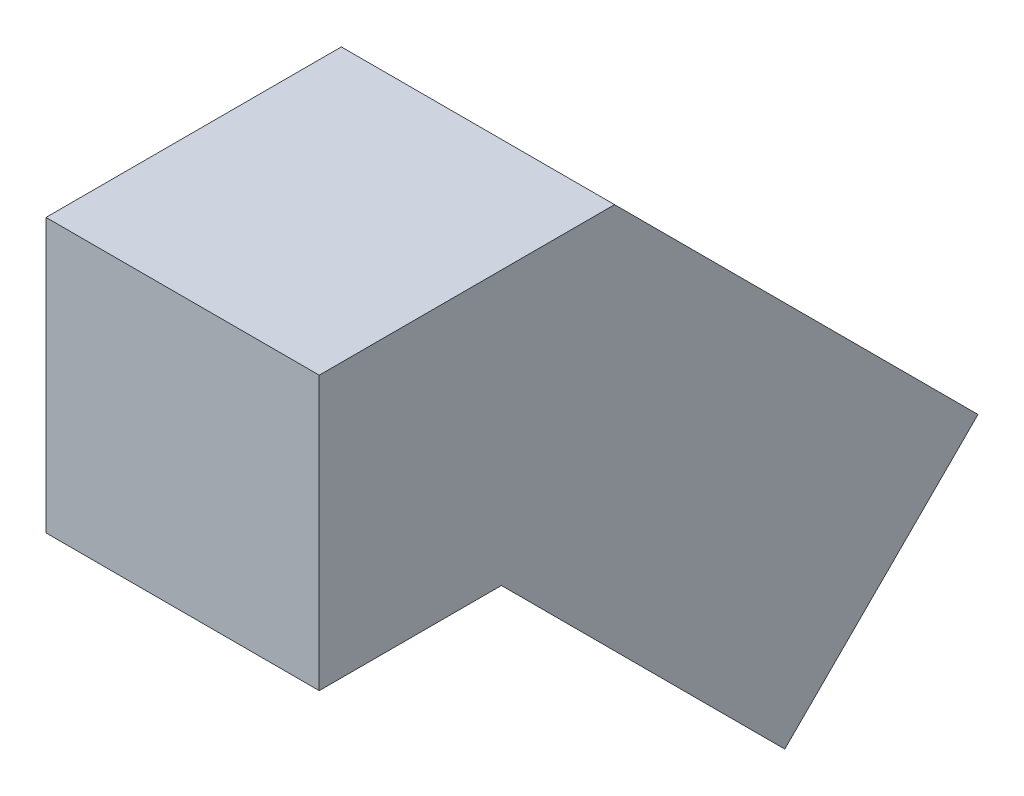
ISO-10303-21;
HEADER;
FILE_DESCRIPTION(('STEP AP214'),'2;1');
FILE_NAME('part.step','',(''),(''),'','','');
FILE_SCHEMA(('AUTOMOTIVE_DESIGN { 1 0 10303 214 1 1 1 1 }'));
ENDSEC;
DATA;
#1=APPLICATION_CONTEXT('core data for automotive mechanical design processes');
#2=APPLICATION_PROTOCOL_DEFINITION('international standard','automotive_design',2000,#1);
#3=PRODUCT_CONTEXT('',#1,'mechanical');
#4=PRODUCT('Part','Part','',(#3));
#5=PRODUCT_RELATED_PRODUCT_CATEGORY('part','',(#4));
#6=PRODUCT_DEFINITION_FORMATION('','',#4);
#7=PRODUCT_DEFINITION_CONTEXT('part definition',#1,'design');
#8=PRODUCT_DEFINITION('design','',#6,#7);
#9=PRODUCT_DEFINITION_SHAPE('','',#8);
#10=(LENGTH_UNIT() NAMED_UNIT(*) SI_UNIT(.MILLI.,.METRE.));
#11=(NAMED_UNIT(*) PLANE_ANGLE_UNIT() SI_UNIT($,.RADIAN.));
#12=(NAMED_UNIT(*) SI_UNIT($,.STERADIAN.) SOLID_ANGLE_UNIT());
#13=UNCERTAINTY_MEASURE_WITH_UNIT(LENGTH_MEASURE(1.E-05),#10,'distance_accuracy_value','');
#14=(GEOMETRIC_REPRESENTATION_CONTEXT(3) GLOBAL_UNCERTAINTY_ASSIGNED_CONTEXT((#13)) GLOBAL_UNIT_ASSIGNED_CONTEXT((#10,
#11,#12)) REPRESENTATION_CONTEXT('',''));
#15=CARTESIAN_POINT('',(0.,0.,0.));
#16=DIRECTION('',(0.,0.,1.));
#17=DIRECTION('',(1.,0.,0.));
#18=AXIS2_PLACEMENT_3D('',#15,#16,#17);
#19=CARTESIAN_POINT('',(150.,-155.56349186104,-255.56349186104));
#20=DIRECTION('',(0.,0.707106781186547,0.707106781186548));
#21=DIRECTION('',(0.,-0.707106781186548,0.707106781186547));
#22=AXIS2_PLACEMENT_3D('',#19,#20,#21);
#23=PLANE('',#22);
#24=DIRECTION('',(0.,0.707106781186548,-0.707106781186547));
#25=VECTOR('',#24,1.);
#26=CARTESIAN_POINT('',(0.,-155.56349186104,-255.56349186104));
#27=LINE('',#26,#25);
#28=CARTESIAN_POINT('',(0.,-155.56349186104,-255.56349186104));
#29=VERTEX_POINT('',#28);
#30=CARTESIAN_POINT('',(0.,-49.4974746830583,-361.629509039022));
#31=VERTEX_POINT('',#30);
#32=EDGE_CURVE('E117',#29,#31,#27,.T.);
#33=ORIENTED_EDGE('',*,*,#32,.T.);
#34=DIRECTION('',(-1.,0.,0.));
#35=VECTOR('',#34,1.);
#36=CARTESIAN_POINT('',(150.,-49.4974746830583,-361.629509039022));
#37=LINE('',#36,#35);
#38=CARTESIAN_POINT('',(150.,-49.4974746830583,-361.629509039022));
#39=VERTEX_POINT('',#38);
#40=EDGE_CURVE('E11',#39,#31,#37,.T.);
#41=ORIENTED_EDGE('',*,*,#40,.F.);
#42=DIRECTION('',(0.,0.707106781186548,-0.707106781186547));
#43=VECTOR('',#42,1.);
#44=CARTESIAN_POINT('',(150.,-155.56349186104,-255.56349186104));
#45=LINE('',#44,#43);
#46=CARTESIAN_POINT('',(150.,-155.56349186104,-255.56349186104));
#47=VERTEX_POINT('',#46);
#48=EDGE_CURVE('E127',#47,#39,#45,.T.);
#49=ORIENTED_EDGE('',*,*,#48,.F.);
#50=DIRECTION('',(-1.,0.,0.));
#51=VECTOR('',#50,1.);
#52=CARTESIAN_POINT('',(150.,-155.56349186104,-255.56349186104));
#53=LINE('',#52,#51);
#54=EDGE_CURVE('E113',#47,#29,#53,.T.);
#55=ORIENTED_EDGE('',*,*,#54,.T.);
#56=EDGE_LOOP('',(#33,#41,#49,#55));
#57=FACE_BOUND('',#56,.T.);
#58=ADVANCED_FACE('F33',(#57),#23,.F.);
#59=CARTESIAN_POINT('',(150.,-49.4974746830583,-361.629509039022));
#60=DIRECTION('',(0.,-0.707106781186548,0.707106781186547));
#61=DIRECTION('',(0.,-0.707106781186547,-0.707106781186548));
#62=AXIS2_PLACEMENT_3D('',#59,#60,#61);
#63=PLANE('',#62);
#64=DIRECTION('',(0.,0.707106781186547,0.707106781186548));
#65=VECTOR('',#64,1.);
#66=CARTESIAN_POINT('',(0.,-49.4974746830583,-361.629509039022));
#67=LINE('',#66,#65);
#68=CARTESIAN_POINT('',(0.,150.,-162.132034355964));
#69=VERTEX_POINT('',#68);
#70=EDGE_CURVE('E120',#31,#69,#67,.T.);
#71=ORIENTED_EDGE('',*,*,#70,.T.);
#72=DIRECTION('',(-1.,0.,0.));
#73=VECTOR('',#72,1.);
#74=CARTESIAN_POINT('',(150.,150.,-162.132034355964));
#75=LINE('',#74,#73);
#76=CARTESIAN_POINT('',(150.,150.,-162.132034355964));
#77=VERTEX_POINT('',#76);
#78=EDGE_CURVE('E41',#77,#69,#75,.T.);
#79=ORIENTED_EDGE('',*,*,#78,.F.);
#80=DIRECTION('',(0.,0.707106781186547,0.707106781186548));
#81=VECTOR('',#80,1.);
#82=CARTESIAN_POINT('',(150.,-49.4974746830583,-361.629509039022));
#83=LINE('',#82,#81);
#84=EDGE_CURVE('E86',#39,#77,#83,.T.);
#85=ORIENTED_EDGE('',*,*,#84,.F.);
#86=ORIENTED_EDGE('',*,*,#40,.T.);
#87=EDGE_LOOP('',(#71,#79,#85,#86));
#88=FACE_BOUND('',#87,.T.);
#89=ADVANCED_FACE('F151',(#88),#63,.F.);
#90=CARTESIAN_POINT('',(150.,150.,0.));
#91=DIRECTION('',(0.,-1.,0.));
#92=DIRECTION('',(0.,0.,-1.));
#93=AXIS2_PLACEMENT_3D('',#90,#91,#92);
#94=PLANE('',#93);
#95=DIRECTION('',(0.,0.,1.));
#96=VECTOR('',#95,1.);
#97=CARTESIAN_POINT('',(0.,150.,0.));
#98=LINE('',#97,#96);
#99=CARTESIAN_POINT('',(0.,150.,0.));
#100=VERTEX_POINT('',#99);
#101=EDGE_CURVE('E122',#69,#100,#98,.T.);
#102=ORIENTED_EDGE('',*,*,#101,.T.);
#103=DIRECTION('',(-1.,0.,0.));
#104=VECTOR('',#103,1.);
#105=CARTESIAN_POINT('',(150.,150.,0.));
#106=LINE('',#105,#104);
#107=CARTESIAN_POINT('',(150.,150.,0.));
#108=VERTEX_POINT('',#107);
#109=EDGE_CURVE('E108',#108,#100,#106,.T.);
#110=ORIENTED_EDGE('',*,*,#109,.F.);
#111=DIRECTION('',(0.,0.,1.));
#112=VECTOR('',#111,1.);
#113=CARTESIAN_POINT('',(150.,150.,0.));
#114=LINE('',#113,#112);
#115=EDGE_CURVE('E99',#77,#108,#114,.T.);
#116=ORIENTED_EDGE('',*,*,#115,.F.);
#117=ORIENTED_EDGE('',*,*,#78,.T.);
#118=EDGE_LOOP('',(#102,#110,#116,#117));
#119=FACE_BOUND('',#118,.T.);
#120=ADVANCED_FACE('F133',(#119),#94,.F.);
#121=CARTESIAN_POINT('',(150.,0.,0.));
#122=DIRECTION('',(0.,0.,-1.));
#123=DIRECTION('',(-1.,0.,0.));
#124=AXIS2_PLACEMENT_3D('',#121,#122,#123);
#125=PLANE('',#124);
#126=DIRECTION('',(0.,-1.,0.));
#127=VECTOR('',#126,1.);
#128=CARTESIAN_POINT('',(0.,0.,0.));
#129=LINE('',#128,#127);
#130=CARTESIAN_POINT('',(0.,0.,0.));
#131=VERTEX_POINT('',#130);
#132=EDGE_CURVE('E107',#100,#131,#129,.T.);
#133=ORIENTED_EDGE('',*,*,#132,.T.);
#134=DIRECTION('',(-1.,0.,0.));
#135=VECTOR('',#134,1.);
#136=CARTESIAN_POINT('',(150.,0.,0.));
#137=LINE('',#136,#135);
#138=CARTESIAN_POINT('',(150.,0.,0.));
#139=VERTEX_POINT('',#138);
#140=EDGE_CURVE('E104',#139,#131,#137,.T.);
#141=ORIENTED_EDGE('',*,*,#140,.F.);
#142=DIRECTION('',(0.,-1.,0.));
#143=VECTOR('',#142,1.);
#144=CARTESIAN_POINT('',(150.,0.,0.));
#145=LINE('',#144,#143);
#146=EDGE_CURVE('E93',#108,#139,#145,.T.);
#147=ORIENTED_EDGE('',*,*,#146,.F.);
#148=ORIENTED_EDGE('',*,*,#109,.T.);
#149=EDGE_LOOP('',(#133,#141,#147,#148));
#150=FACE_BOUND('',#149,.T.);
#151=ADVANCED_FACE('F105',(#150),#125,.F.);
#152=CARTESIAN_POINT('',(150.,0.,0.));
#153=DIRECTION('',(0.,1.,0.));
#154=DIRECTION('',(0.,0.,1.));
#155=AXIS2_PLACEMENT_3D('',#152,#153,#154);
#156=PLANE('',#155);
#157=DIRECTION('',(0.,0.,-1.));
#158=VECTOR('',#157,1.);
#159=CARTESIAN_POINT('',(0.,0.,0.));
#160=LINE('',#159,#158);
#161=CARTESIAN_POINT('',(0.,0.,-100.));
#162=VERTEX_POINT('',#161);
#163=EDGE_CURVE('E72',#131,#162,#160,.T.);
#164=ORIENTED_EDGE('',*,*,#163,.T.);
#165=DIRECTION('',(-1.,0.,0.));
#166=VECTOR('',#165,1.);
#167=CARTESIAN_POINT('',(150.,0.,-100.));
#168=LINE('',#167,#166);
#169=CARTESIAN_POINT('',(150.,0.,-100.));
#170=VERTEX_POINT('',#169);
#171=EDGE_CURVE('E109',#170,#162,#168,.T.);
#172=ORIENTED_EDGE('',*,*,#171,.F.);
#173=DIRECTION('',(0.,0.,-1.));
#174=VECTOR('',#173,1.);
#175=CARTESIAN_POINT('',(150.,0.,0.));
#176=LINE('',#175,#174);
#177=EDGE_CURVE('E97',#139,#170,#176,.T.);
#178=ORIENTED_EDGE('',*,*,#177,.F.);
#179=ORIENTED_EDGE('',*,*,#140,.T.);
#180=EDGE_LOOP('',(#164,#172,#178,#179));
#181=FACE_BOUND('',#180,.T.);
#182=ADVANCED_FACE('F111',(#181),#156,.F.);
#183=CARTESIAN_POINT('',(150.,0.,-100.));
#184=DIRECTION('',(0.,0.707106781186547,-0.707106781186548));
#185=DIRECTION('',(0.,0.707106781186548,0.707106781186547));
#186=AXIS2_PLACEMENT_3D('',#183,#184,#185);
#187=PLANE('',#186);
#188=DIRECTION('',(0.,-0.707106781186548,-0.707106781186547));
#189=VECTOR('',#188,1.);
#190=CARTESIAN_POINT('',(0.,0.,-100.));
#191=LINE('',#190,#189);
#192=EDGE_CURVE('E78',#162,#29,#191,.T.);
#193=ORIENTED_EDGE('',*,*,#192,.T.);
#194=ORIENTED_EDGE('',*,*,#54,.F.);
#195=DIRECTION('',(0.,-0.707106781186548,-0.707106781186547));
#196=VECTOR('',#195,1.);
#197=CARTESIAN_POINT('',(150.,0.,-100.));
#198=LINE('',#197,#196);
#199=EDGE_CURVE('E49',#170,#47,#198,.T.);
#200=ORIENTED_EDGE('',*,*,#199,.F.);
#201=ORIENTED_EDGE('',*,*,#171,.T.);
#202=EDGE_LOOP('',(#193,#194,#200,#201));
#203=FACE_BOUND('',#202,.T.);
#204=ADVANCED_FACE('F140',(#203),#187,.F.);
#205=CARTESIAN_POINT('',(150.,0.,0.));
#206=DIRECTION('',(1.,0.,0.));
#207=DIRECTION('',(0.,0.,-1.));
#208=AXIS2_PLACEMENT_3D('',#205,#206,#207);
#209=PLANE('',#208);
#210=ORIENTED_EDGE('',*,*,#48,.T.);
#211=ORIENTED_EDGE('',*,*,#84,.T.);
#212=ORIENTED_EDGE('',*,*,#115,.T.);
#213=ORIENTED_EDGE('',*,*,#146,.T.);
#214=ORIENTED_EDGE('',*,*,#177,.T.);
#215=ORIENTED_EDGE('',*,*,#199,.T.);
#216=EDGE_LOOP('',(#210,#211,#212,#213,#214,#215));
#217=FACE_BOUND('',#216,.T.);
#218=ADVANCED_FACE('F95',(#217),#209,.T.);
#219=CARTESIAN_POINT('',(0.,0.,0.));
#220=DIRECTION('',(1.,0.,0.));
#221=DIRECTION('',(0.,0.,-1.));
#222=AXIS2_PLACEMENT_3D('',#219,#220,#221);
#223=PLANE('',#222);
#224=ORIENTED_EDGE('',*,*,#32,.F.);
#225=ORIENTED_EDGE('',*,*,#192,.F.);
#226=ORIENTED_EDGE('',*,*,#163,.F.);
#227=ORIENTED_EDGE('',*,*,#132,.F.);
#228=ORIENTED_EDGE('',*,*,#101,.F.);
#229=ORIENTED_EDGE('',*,*,#70,.F.);
#230=EDGE_LOOP('',(#224,#225,#226,#227,#228,#229));
#231=FACE_BOUND('',#230,.T.);
#232=ADVANCED_FACE('F136',(#231),#223,.F.);
#233=CLOSED_SHELL('',(#58,#89,#120,#151,#182,#204,#218,#232));
#234=MANIFOLD_SOLID_BREP('B2',#233);
#235=ADVANCED_BREP_SHAPE_REPRESENTATION('',(#18,#234),#14);
#236=SHAPE_DEFINITION_REPRESENTATION(#9,#235);
ENDSEC;
END-ISO-10303-21;
